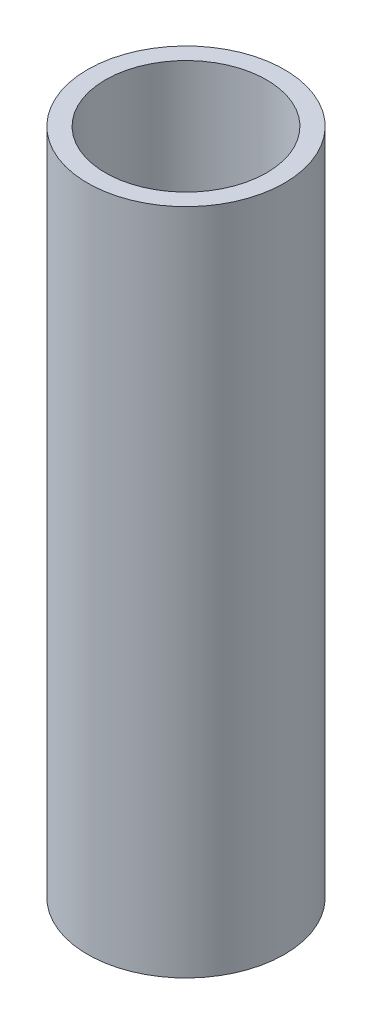
ISO-10303-21;
HEADER;
FILE_DESCRIPTION(('STEP AP214'),'2;1');
FILE_NAME('part.step','',(''),(''),'','','');
FILE_SCHEMA(('AUTOMOTIVE_DESIGN { 1 0 10303 214 1 1 1 1 }'));
ENDSEC;
DATA;
#1=APPLICATION_CONTEXT('core data for automotive mechanical design processes');
#2=APPLICATION_PROTOCOL_DEFINITION('international standard','automotive_design',2000,#1);
#3=PRODUCT_CONTEXT('',#1,'mechanical');
#4=PRODUCT('Part','Part','',(#3));
#5=PRODUCT_RELATED_PRODUCT_CATEGORY('part','',(#4));
#6=PRODUCT_DEFINITION_FORMATION('','',#4);
#7=PRODUCT_DEFINITION_CONTEXT('part definition',#1,'design');
#8=PRODUCT_DEFINITION('design','',#6,#7);
#9=PRODUCT_DEFINITION_SHAPE('','',#8);
#10=(LENGTH_UNIT() NAMED_UNIT(*) SI_UNIT(.MILLI.,.METRE.));
#11=(NAMED_UNIT(*) PLANE_ANGLE_UNIT() SI_UNIT($,.RADIAN.));
#12=(NAMED_UNIT(*) SI_UNIT($,.STERADIAN.) SOLID_ANGLE_UNIT());
#13=UNCERTAINTY_MEASURE_WITH_UNIT(LENGTH_MEASURE(1.E-05),#10,'distance_accuracy_value','');
#14=(GEOMETRIC_REPRESENTATION_CONTEXT(3) GLOBAL_UNCERTAINTY_ASSIGNED_CONTEXT((#13)) GLOBAL_UNIT_ASSIGNED_CONTEXT((#10,
#11,#12)) REPRESENTATION_CONTEXT('',''));
#15=CARTESIAN_POINT('',(0.,0.,0.));
#16=DIRECTION('',(0.,0.,1.));
#17=DIRECTION('',(1.,0.,0.));
#18=AXIS2_PLACEMENT_3D('',#15,#16,#17);
#19=CARTESIAN_POINT('',(0.699999999999995,33.8555537231435,-1.6));
#20=DIRECTION('',(0.,-1.,0.));
#21=DIRECTION('',(1.,0.,0.));
#22=AXIS2_PLACEMENT_3D('',#19,#20,#21);
#23=PLANE('',#22);
#24=CARTESIAN_POINT('',(0.699999999999995,33.8555537231435,-1.6));
#25=DIRECTION('',(0.,-1.,0.));
#26=DIRECTION('',(1.,0.,0.));
#27=AXIS2_PLACEMENT_3D('',#24,#25,#26);
#28=CIRCLE('',#27,0.7366);
#29=CARTESIAN_POINT('',(-0.0366000000000056,33.8555537231435,-1.6));
#30=VERTEX_POINT('',#29);
#31=EDGE_CURVE('E38',#30,#30,#28,.T.);
#32=ORIENTED_EDGE('',*,*,#31,.F.);
#33=EDGE_LOOP('',(#32));
#34=FACE_BOUND('',#33,.T.);
#35=CARTESIAN_POINT('',(0.699999999999995,33.8555537231435,-1.6));
#36=DIRECTION('',(0.,-1.,0.));
#37=DIRECTION('',(1.,0.,0.));
#38=AXIS2_PLACEMENT_3D('',#35,#36,#37);
#39=CIRCLE('',#38,0.60325);
#40=CARTESIAN_POINT('',(1.30324999999999,33.8555537231435,-1.6));
#41=VERTEX_POINT('',#40);
#42=EDGE_CURVE('E47',#41,#41,#39,.T.);
#43=ORIENTED_EDGE('',*,*,#42,.T.);
#44=EDGE_LOOP('',(#43));
#45=FACE_BOUND('',#44,.T.);
#46=ADVANCED_FACE('F31',(#34,#45),#23,.F.);
#47=CARTESIAN_POINT('',(0.699999999999995,26.7721343030555,-1.6));
#48=DIRECTION('',(0.,1.,0.));
#49=DIRECTION('',(-1.,0.,0.));
#50=AXIS2_PLACEMENT_3D('',#47,#48,#49);
#51=CYLINDRICAL_SURFACE('',#50,0.7366);
#52=CARTESIAN_POINT('',(0.699999999999995,28.8555537231435,-1.6));
#53=DIRECTION('',(0.,1.,0.));
#54=DIRECTION('',(-1.,0.,0.));
#55=AXIS2_PLACEMENT_3D('',#52,#53,#54);
#56=CIRCLE('',#55,0.7366);
#57=CARTESIAN_POINT('',(-0.0366000000000054,28.8555537231435,-1.6));
#58=VERTEX_POINT('',#57);
#59=EDGE_CURVE('E42',#58,#58,#56,.T.);
#60=CARTESIAN_POINT('',(-0.0366000000000054,28.8555537231435,-1.6));
#61=CARTESIAN_POINT('',(-0.0366000000000054,28.9076370564769,-1.6));
#62=CARTESIAN_POINT('',(-0.0366000000000054,28.9597203898102,-1.6));
#63=CARTESIAN_POINT('',(-0.0366000000000054,29.0638870564769,-1.6));
#64=CARTESIAN_POINT('',(-0.0366000000000054,29.1159703898102,-1.6));
#65=CARTESIAN_POINT('',(-0.0366000000000054,29.2201370564769,-1.6));
#66=CARTESIAN_POINT('',(-0.0366000000000054,29.2722203898102,-1.6));
#67=CARTESIAN_POINT('',(-0.0366000000000054,29.3763870564769,-1.6));
#68=CARTESIAN_POINT('',(-0.0366000000000054,29.4284703898102,-1.6));
#69=CARTESIAN_POINT('',(-0.0366000000000054,29.5326370564769,-1.6));
#70=CARTESIAN_POINT('',(-0.0366000000000054,29.5847203898102,-1.6));
#71=CARTESIAN_POINT('',(-0.0366000000000054,29.6888870564769,-1.6));
#72=CARTESIAN_POINT('',(-0.0366000000000054,29.7409703898102,-1.6));
#73=CARTESIAN_POINT('',(-0.0366000000000054,29.8451370564769,-1.6));
#74=CARTESIAN_POINT('',(-0.0366000000000055,29.8972203898102,-1.6));
#75=CARTESIAN_POINT('',(-0.0366000000000055,30.0013870564769,-1.6));
#76=CARTESIAN_POINT('',(-0.0366000000000055,30.0534703898102,-1.6));
#77=CARTESIAN_POINT('',(-0.0366000000000055,30.1576370564769,-1.6));
#78=CARTESIAN_POINT('',(-0.0366000000000055,30.2097203898102,-1.6));
#79=CARTESIAN_POINT('',(-0.0366000000000055,30.3138870564769,-1.6));
#80=CARTESIAN_POINT('',(-0.0366000000000055,30.3659703898102,-1.6));
#81=CARTESIAN_POINT('',(-0.0366000000000055,30.4701370564769,-1.6));
#82=CARTESIAN_POINT('',(-0.0366000000000055,30.5222203898102,-1.6));
#83=CARTESIAN_POINT('',(-0.0366000000000055,30.6263870564769,-1.6));
#84=CARTESIAN_POINT('',(-0.0366000000000055,30.6784703898102,-1.6));
#85=CARTESIAN_POINT('',(-0.0366000000000055,30.7826370564769,-1.6));
#86=CARTESIAN_POINT('',(-0.0366000000000055,30.8347203898102,-1.6));
#87=CARTESIAN_POINT('',(-0.0366000000000055,30.9388870564769,-1.6));
#88=CARTESIAN_POINT('',(-0.0366000000000055,30.9909703898102,-1.6));
#89=CARTESIAN_POINT('',(-0.0366000000000055,31.0951370564769,-1.6));
#90=CARTESIAN_POINT('',(-0.0366000000000055,31.1472203898102,-1.6));
#91=CARTESIAN_POINT('',(-0.0366000000000055,31.2513870564769,-1.6));
#92=CARTESIAN_POINT('',(-0.0366000000000055,31.3034703898102,-1.6));
#93=CARTESIAN_POINT('',(-0.0366000000000055,31.4076370564769,-1.6));
#94=CARTESIAN_POINT('',(-0.0366000000000055,31.4597203898102,-1.6));
#95=CARTESIAN_POINT('',(-0.0366000000000055,31.5638870564769,-1.6));
#96=CARTESIAN_POINT('',(-0.0366000000000055,31.6159703898102,-1.6));
#97=CARTESIAN_POINT('',(-0.0366000000000055,31.7201370564769,-1.6));
#98=CARTESIAN_POINT('',(-0.0366000000000055,31.7722203898102,-1.6));
#99=CARTESIAN_POINT('',(-0.0366000000000055,31.8763870564769,-1.6));
#100=CARTESIAN_POINT('',(-0.0366000000000055,31.9284703898102,-1.6));
#101=CARTESIAN_POINT('',(-0.0366000000000055,32.0326370564769,-1.6));
#102=CARTESIAN_POINT('',(-0.0366000000000055,32.0847203898102,-1.6));
#103=CARTESIAN_POINT('',(-0.0366000000000055,32.1888870564769,-1.6));
#104=CARTESIAN_POINT('',(-0.0366000000000055,32.2409703898102,-1.6));
#105=CARTESIAN_POINT('',(-0.0366000000000055,32.3451370564769,-1.6));
#106=CARTESIAN_POINT('',(-0.0366000000000055,32.3972203898102,-1.6));
#107=CARTESIAN_POINT('',(-0.0366000000000055,32.5013870564769,-1.6));
#108=CARTESIAN_POINT('',(-0.0366000000000056,32.5534703898102,-1.6));
#109=CARTESIAN_POINT('',(-0.0366000000000056,32.6576370564769,-1.6));
#110=CARTESIAN_POINT('',(-0.0366000000000056,32.7097203898102,-1.6));
#111=CARTESIAN_POINT('',(-0.0366000000000056,32.8138870564769,-1.6));
#112=CARTESIAN_POINT('',(-0.0366000000000056,32.8659703898102,-1.6));
#113=CARTESIAN_POINT('',(-0.0366000000000056,32.9701370564769,-1.6));
#114=CARTESIAN_POINT('',(-0.0366000000000056,33.0222203898102,-1.6));
#115=CARTESIAN_POINT('',(-0.0366000000000056,33.1263870564769,-1.6));
#116=CARTESIAN_POINT('',(-0.0366000000000056,33.1784703898102,-1.6));
#117=CARTESIAN_POINT('',(-0.0366000000000056,33.2826370564769,-1.6));
#118=CARTESIAN_POINT('',(-0.0366000000000056,33.3347203898102,-1.6));
#119=CARTESIAN_POINT('',(-0.0366000000000056,33.4388870564769,-1.6));
#120=CARTESIAN_POINT('',(-0.0366000000000056,33.4909703898102,-1.6));
#121=CARTESIAN_POINT('',(-0.0366000000000056,33.5951370564769,-1.6));
#122=CARTESIAN_POINT('',(-0.0366000000000056,33.6472203898102,-1.6));
#123=CARTESIAN_POINT('',(-0.0366000000000056,33.7513870564769,-1.6));
#124=CARTESIAN_POINT('',(-0.0366000000000056,33.8034703898102,-1.6));
#125=CARTESIAN_POINT('',(-0.0366000000000056,33.8555537231435,-1.6));
#126=B_SPLINE_CURVE_WITH_KNOTS('',3,(#60,#61,#62,#63,#64,#65,#66,#67,#68,#69,#70,#71,#72,#73,
#74,#75,#76,#77,#78,#79,#80,#81,#82,#83,#84,#85,#86,#87,#88,#89,#90,#91,#92,#93,#94,#95,#96,#97,
#98,#99,#100,#101,#102,#103,#104,#105,#106,#107,#108,#109,#110,#111,#112,#113,#114,#115,#116,
#117,#118,#119,#120,#121,#122,#123,#124,#125),.UNSPECIFIED.,.F.,.F.,(4,2,2,2,2,2,2,2,2,2,2,2,2,
2,2,2,2,2,2,2,2,2,2,2,2,2,2,2,2,2,2,2,4),(0.,0.15625,0.312499999999997,0.46875,
0.624999999999997,0.781249999999997,0.937499999999997,1.09375,1.25,1.40625,1.5625,1.71875,1.875,
2.03125,2.1875,2.34375,2.5,2.65625,2.8125,2.96875,3.125,3.28125,3.4375,3.59375,3.75,3.90625,
4.06249999999999,4.21875,4.375,4.53125,4.68749999999999,4.84375,4.99999999999999),.UNSPECIFIED.);
#127=EDGE_CURVE('BSEAM55',#58,#30,#126,.T.);
#128=ORIENTED_EDGE('',*,*,#59,.T.);
#129=ORIENTED_EDGE('',*,*,#31,.T.);
#130=ORIENTED_EDGE('',*,*,#127,.T.);
#131=ORIENTED_EDGE('',*,*,#127,.F.);
#132=EDGE_LOOP('',(#128,#130,#129,#131));
#133=FACE_BOUND('',#132,.T.);
#134=ADVANCED_FACE('F55',(#133),#51,.T.);
#135=CARTESIAN_POINT('',(0.699999999999995,26.7721343030555,-1.6));
#136=DIRECTION('',(0.,1.,0.));
#137=DIRECTION('',(-1.,0.,0.));
#138=AXIS2_PLACEMENT_3D('',#135,#136,#137);
#139=CYLINDRICAL_SURFACE('',#138,0.60325);
#140=CARTESIAN_POINT('',(0.699999999999995,28.8555537231435,-1.6));
#141=DIRECTION('',(0.,1.,0.));
#142=DIRECTION('',(-1.,0.,0.));
#143=AXIS2_PLACEMENT_3D('',#140,#141,#142);
#144=CIRCLE('',#143,0.60325);
#145=CARTESIAN_POINT('',(0.0967499999999945,28.8555537231435,-1.6));
#146=VERTEX_POINT('',#145);
#147=EDGE_CURVE('E10',#146,#146,#144,.T.);
#148=ORIENTED_EDGE('',*,*,#147,.F.);
#149=EDGE_LOOP('',(#148));
#150=FACE_BOUND('',#149,.T.);
#151=ORIENTED_EDGE('',*,*,#42,.F.);
#152=EDGE_LOOP('',(#151));
#153=FACE_BOUND('',#152,.T.);
#154=ADVANCED_FACE('F53',(#150,#153),#139,.F.);
#155=CARTESIAN_POINT('',(-2.8,28.8555537231435,0.));
#156=DIRECTION('',(0.,1.,0.));
#157=DIRECTION('',(-1.,0.,0.));
#158=AXIS2_PLACEMENT_3D('',#155,#156,#157);
#159=PLANE('',#158);
#160=ORIENTED_EDGE('',*,*,#147,.T.);
#161=EDGE_LOOP('',(#160));
#162=FACE_BOUND('',#161,.T.);
#163=ORIENTED_EDGE('',*,*,#59,.F.);
#164=EDGE_LOOP('',(#163));
#165=FACE_BOUND('',#164,.T.);
#166=ADVANCED_FACE('F33',(#162,#165),#159,.F.);
#167=CLOSED_SHELL('',(#46,#134,#154,#166));
#168=MANIFOLD_SOLID_BREP('B2',#167);
#169=ADVANCED_BREP_SHAPE_REPRESENTATION('',(#18,#168),#14);
#170=SHAPE_DEFINITION_REPRESENTATION(#9,#169);
ENDSEC;
END-ISO-10303-21;
